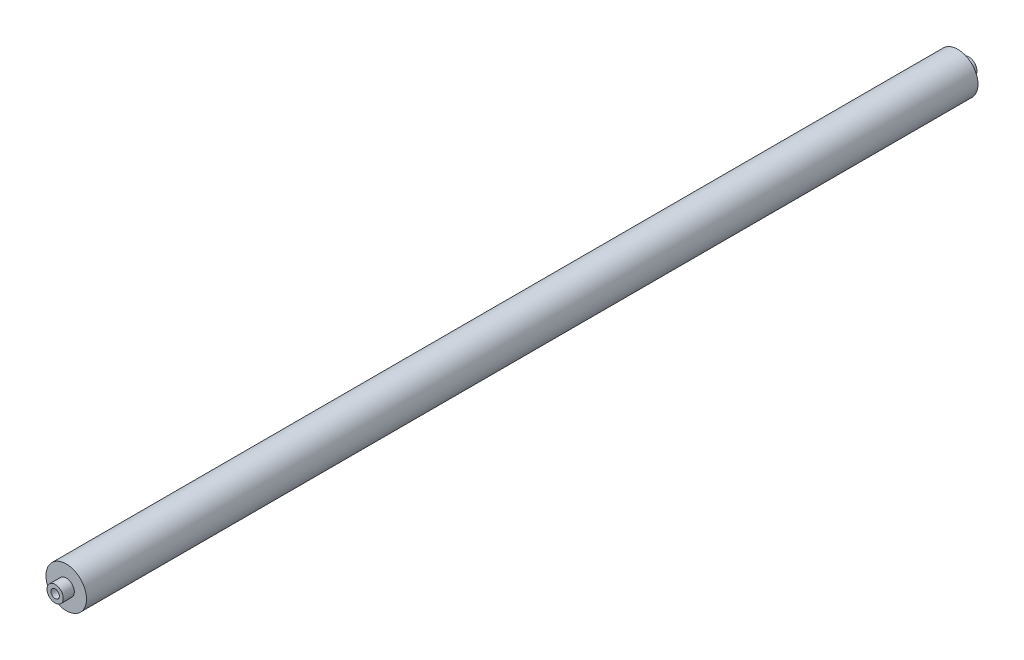
ISO-10303-21;
HEADER;
FILE_DESCRIPTION(('STEP AP214'),'2;1');
FILE_NAME('part.step','',(''),(''),'','','');
FILE_SCHEMA(('AUTOMOTIVE_DESIGN { 1 0 10303 214 1 1 1 1 }'));
ENDSEC;
DATA;
#1=APPLICATION_CONTEXT('core data for automotive mechanical design processes');
#2=APPLICATION_PROTOCOL_DEFINITION('international standard','automotive_design',2000,#1);
#3=PRODUCT_CONTEXT('',#1,'mechanical');
#4=PRODUCT('Part','Part','',(#3));
#5=PRODUCT_RELATED_PRODUCT_CATEGORY('part','',(#4));
#6=PRODUCT_DEFINITION_FORMATION('','',#4);
#7=PRODUCT_DEFINITION_CONTEXT('part definition',#1,'design');
#8=PRODUCT_DEFINITION('design','',#6,#7);
#9=PRODUCT_DEFINITION_SHAPE('','',#8);
#10=(LENGTH_UNIT() NAMED_UNIT(*) SI_UNIT(.MILLI.,.METRE.));
#11=(NAMED_UNIT(*) PLANE_ANGLE_UNIT() SI_UNIT($,.RADIAN.));
#12=(NAMED_UNIT(*) SI_UNIT($,.STERADIAN.) SOLID_ANGLE_UNIT());
#13=UNCERTAINTY_MEASURE_WITH_UNIT(LENGTH_MEASURE(1.E-05),#10,'distance_accuracy_value','');
#14=(GEOMETRIC_REPRESENTATION_CONTEXT(3) GLOBAL_UNCERTAINTY_ASSIGNED_CONTEXT((#13)) GLOBAL_UNIT_ASSIGNED_CONTEXT((#10,
#11,#12)) REPRESENTATION_CONTEXT('',''));
#15=CARTESIAN_POINT('',(0.,0.,0.));
#16=DIRECTION('',(0.,0.,1.));
#17=DIRECTION('',(1.,0.,0.));
#18=AXIS2_PLACEMENT_3D('',#15,#16,#17);
#19=CARTESIAN_POINT('',(0.,0.,698.5));
#20=DIRECTION('',(0.,0.,-1.));
#21=DIRECTION('',(-1.,0.,0.));
#22=AXIS2_PLACEMENT_3D('',#19,#20,#21);
#23=CYLINDRICAL_SURFACE('',#22,15.875);
#24=CARTESIAN_POINT('',(0.,0.,698.5));
#25=DIRECTION('',(0.,0.,1.));
#26=DIRECTION('',(1.,0.,0.));
#27=AXIS2_PLACEMENT_3D('',#24,#25,#26);
#28=CIRCLE('',#27,15.875);
#29=CARTESIAN_POINT('',(15.875,0.,698.5));
#30=VERTEX_POINT('',#29);
#31=EDGE_CURVE('E90',#30,#30,#28,.T.);
#32=ORIENTED_EDGE('',*,*,#31,.F.);
#33=EDGE_LOOP('',(#32));
#34=FACE_BOUND('',#33,.T.);
#35=CARTESIAN_POINT('',(0.,0.,0.));
#36=DIRECTION('',(0.,0.,1.));
#37=DIRECTION('',(1.,0.,0.));
#38=AXIS2_PLACEMENT_3D('',#35,#36,#37);
#39=CIRCLE('',#38,15.875);
#40=CARTESIAN_POINT('',(15.875,0.,0.));
#41=VERTEX_POINT('',#40);
#42=EDGE_CURVE('E94',#41,#41,#39,.T.);
#43=ORIENTED_EDGE('',*,*,#42,.T.);
#44=EDGE_LOOP('',(#43));
#45=FACE_BOUND('',#44,.T.);
#46=ADVANCED_FACE('F43',(#34,#45),#23,.T.);
#47=CARTESIAN_POINT('',(0.,0.,698.5));
#48=DIRECTION('',(0.,0.,1.));
#49=DIRECTION('',(1.,0.,0.));
#50=AXIS2_PLACEMENT_3D('',#47,#48,#49);
#51=PLANE('',#50);
#52=CARTESIAN_POINT('',(0.,0.,698.5));
#53=DIRECTION('',(0.,0.,1.));
#54=DIRECTION('',(1.,0.,0.));
#55=AXIS2_PLACEMENT_3D('',#52,#53,#54);
#56=CIRCLE('',#55,6.35);
#57=CARTESIAN_POINT('',(6.35,0.,698.5));
#58=VERTEX_POINT('',#57);
#59=EDGE_CURVE('E52',#58,#58,#56,.T.);
#60=ORIENTED_EDGE('',*,*,#59,.F.);
#61=EDGE_LOOP('',(#60));
#62=FACE_BOUND('',#61,.T.);
#63=ORIENTED_EDGE('',*,*,#31,.T.);
#64=EDGE_LOOP('',(#63));
#65=FACE_BOUND('',#64,.T.);
#66=ADVANCED_FACE('F121',(#62,#65),#51,.T.);
#67=CARTESIAN_POINT('',(0.,0.,0.));
#68=DIRECTION('',(0.,0.,1.));
#69=DIRECTION('',(1.,0.,0.));
#70=AXIS2_PLACEMENT_3D('',#67,#68,#69);
#71=PLANE('',#70);
#72=CARTESIAN_POINT('',(0.,0.,0.));
#73=DIRECTION('',(0.,0.,-1.));
#74=DIRECTION('',(-1.,0.,0.));
#75=AXIS2_PLACEMENT_3D('',#72,#73,#74);
#76=CIRCLE('',#75,6.35);
#77=CARTESIAN_POINT('',(-6.35,0.,0.));
#78=VERTEX_POINT('',#77);
#79=EDGE_CURVE('E11',#78,#78,#76,.T.);
#80=ORIENTED_EDGE('',*,*,#79,.F.);
#81=EDGE_LOOP('',(#80));
#82=FACE_BOUND('',#81,.T.);
#83=ORIENTED_EDGE('',*,*,#42,.F.);
#84=EDGE_LOOP('',(#83));
#85=FACE_BOUND('',#84,.T.);
#86=ADVANCED_FACE('F126',(#82,#85),#71,.F.);
#87=CARTESIAN_POINT('',(0.,0.,711.2));
#88=DIRECTION('',(0.,0.,-1.));
#89=DIRECTION('',(-1.,0.,0.));
#90=AXIS2_PLACEMENT_3D('',#87,#88,#89);
#91=CYLINDRICAL_SURFACE('',#90,6.35);
#92=CARTESIAN_POINT('',(0.,0.,707.2));
#93=DIRECTION('',(0.,0.,-1.));
#94=DIRECTION('',(-1.,0.,0.));
#95=AXIS2_PLACEMENT_3D('',#92,#93,#94);
#96=CIRCLE('',#95,6.35);
#97=CARTESIAN_POINT('',(-6.35,0.,707.2));
#98=VERTEX_POINT('',#97);
#99=EDGE_CURVE('E85',#98,#98,#96,.T.);
#100=ORIENTED_EDGE('',*,*,#99,.T.);
#101=EDGE_LOOP('',(#100));
#102=FACE_BOUND('',#101,.T.);
#103=ORIENTED_EDGE('',*,*,#59,.T.);
#104=EDGE_LOOP('',(#103));
#105=FACE_BOUND('',#104,.T.);
#106=ADVANCED_FACE('F101',(#102,#105),#91,.T.);
#107=CARTESIAN_POINT('',(0.,0.,-12.7));
#108=DIRECTION('',(0.,0.,1.));
#109=DIRECTION('',(1.,0.,0.));
#110=AXIS2_PLACEMENT_3D('',#107,#108,#109);
#111=CYLINDRICAL_SURFACE('',#110,6.35);
#112=CARTESIAN_POINT('',(0.,0.,-8.7));
#113=DIRECTION('',(0.,0.,1.));
#114=DIRECTION('',(1.,0.,0.));
#115=AXIS2_PLACEMENT_3D('',#112,#113,#114);
#116=CIRCLE('',#115,6.35);
#117=CARTESIAN_POINT('',(6.35,0.,-8.7));
#118=VERTEX_POINT('',#117);
#119=EDGE_CURVE('E46',#118,#118,#116,.T.);
#120=ORIENTED_EDGE('',*,*,#119,.T.);
#121=EDGE_LOOP('',(#120));
#122=FACE_BOUND('',#121,.T.);
#123=ORIENTED_EDGE('',*,*,#79,.T.);
#124=EDGE_LOOP('',(#123));
#125=FACE_BOUND('',#124,.T.);
#126=ADVANCED_FACE('F107',(#122,#125),#111,.T.);
#127=CARTESIAN_POINT('',(3.29999999999996,0.,707.2));
#128=DIRECTION('',(0.,0.,-1.));
#129=DIRECTION('',(-1.,0.,0.));
#130=AXIS2_PLACEMENT_3D('',#127,#128,#129);
#131=PLANE('',#130);
#132=CARTESIAN_POINT('',(0.,0.,707.2));
#133=DIRECTION('',(0.,0.,1.));
#134=DIRECTION('',(1.,0.,0.));
#135=AXIS2_PLACEMENT_3D('',#132,#133,#134);
#136=CIRCLE('',#135,3.29999999999996);
#137=CARTESIAN_POINT('',(3.29999999999996,0.,707.2));
#138=VERTEX_POINT('',#137);
#139=EDGE_CURVE('E75',#138,#138,#136,.T.);
#140=ORIENTED_EDGE('',*,*,#139,.F.);
#141=EDGE_LOOP('',(#140));
#142=FACE_BOUND('',#141,.T.);
#143=ORIENTED_EDGE('',*,*,#99,.F.);
#144=EDGE_LOOP('',(#143));
#145=FACE_BOUND('',#144,.T.);
#146=ADVANCED_FACE('F104',(#142,#145),#131,.F.);
#147=CARTESIAN_POINT('',(0.,0.,406.4));
#148=DIRECTION('',(0.,0.,1.));
#149=DIRECTION('',(1.,0.,0.));
#150=AXIS2_PLACEMENT_3D('',#147,#148,#149);
#151=CONICAL_SURFACE('',#150,3.29999999999993,1.02974425867663);
#152=CARTESIAN_POINT('',(0.,0.,404.417159957209));
#153=VERTEX_POINT('',#152);
#154=VERTEX_LOOP('',#153);
#155=FACE_BOUND('',#154,.T.);
#156=CARTESIAN_POINT('',(0.,0.,406.4));
#157=DIRECTION('',(0.,0.,1.));
#158=DIRECTION('',(1.,0.,0.));
#159=AXIS2_PLACEMENT_3D('',#156,#157,#158);
#160=CIRCLE('',#159,3.29999999999993);
#161=CARTESIAN_POINT('',(3.29999999999993,0.,406.4));
#162=VERTEX_POINT('',#161);
#163=EDGE_CURVE('E82',#162,#162,#160,.T.);
#164=ORIENTED_EDGE('',*,*,#163,.T.);
#165=EDGE_LOOP('',(#164));
#166=FACE_BOUND('',#165,.T.);
#167=ADVANCED_FACE('F106',(#155,#166),#151,.F.);
#168=CARTESIAN_POINT('',(0.,0.,711.2));
#169=DIRECTION('',(0.,0.,1.));
#170=DIRECTION('',(1.,0.,0.));
#171=AXIS2_PLACEMENT_3D('',#168,#169,#170);
#172=CYLINDRICAL_SURFACE('',#171,3.29999999999994);
#173=ORIENTED_EDGE('',*,*,#163,.F.);
#174=EDGE_LOOP('',(#173));
#175=FACE_BOUND('',#174,.T.);
#176=ORIENTED_EDGE('',*,*,#139,.T.);
#177=EDGE_LOOP('',(#176));
#178=FACE_BOUND('',#177,.T.);
#179=ADVANCED_FACE('F114',(#175,#178),#172,.F.);
#180=CARTESIAN_POINT('',(3.29999999999996,0.,-8.7));
#181=DIRECTION('',(0.,0.,1.));
#182=DIRECTION('',(1.,0.,0.));
#183=AXIS2_PLACEMENT_3D('',#180,#181,#182);
#184=PLANE('',#183);
#185=CARTESIAN_POINT('',(0.,0.,-8.7));
#186=DIRECTION('',(0.,0.,-1.));
#187=DIRECTION('',(-1.,0.,0.));
#188=AXIS2_PLACEMENT_3D('',#185,#186,#187);
#189=CIRCLE('',#188,3.29999999999996);
#190=CARTESIAN_POINT('',(-3.29999999999996,0.,-8.7));
#191=VERTEX_POINT('',#190);
#192=EDGE_CURVE('E70',#191,#191,#189,.T.);
#193=ORIENTED_EDGE('',*,*,#192,.F.);
#194=EDGE_LOOP('',(#193));
#195=FACE_BOUND('',#194,.T.);
#196=ORIENTED_EDGE('',*,*,#119,.F.);
#197=EDGE_LOOP('',(#196));
#198=FACE_BOUND('',#197,.T.);
#199=ADVANCED_FACE('F63',(#195,#198),#184,.F.);
#200=CARTESIAN_POINT('',(0.,0.,292.1));
#201=DIRECTION('',(0.,0.,-1.));
#202=DIRECTION('',(-1.,0.,0.));
#203=AXIS2_PLACEMENT_3D('',#200,#201,#202);
#204=CONICAL_SURFACE('',#203,3.29999999999992,1.02974425867664);
#205=CARTESIAN_POINT('',(0.,0.,294.082840042791));
#206=VERTEX_POINT('',#205);
#207=VERTEX_LOOP('',#206);
#208=FACE_BOUND('',#207,.T.);
#209=CARTESIAN_POINT('',(0.,0.,292.1));
#210=DIRECTION('',(0.,0.,-1.));
#211=DIRECTION('',(-1.,0.,0.));
#212=AXIS2_PLACEMENT_3D('',#209,#210,#211);
#213=CIRCLE('',#212,3.29999999999992);
#214=CARTESIAN_POINT('',(-3.29999999999992,0.,292.1));
#215=VERTEX_POINT('',#214);
#216=EDGE_CURVE('E67',#215,#215,#213,.T.);
#217=ORIENTED_EDGE('',*,*,#216,.T.);
#218=EDGE_LOOP('',(#217));
#219=FACE_BOUND('',#218,.T.);
#220=ADVANCED_FACE('F59',(#208,#219),#204,.F.);
#221=CARTESIAN_POINT('',(0.,0.,-12.7));
#222=DIRECTION('',(0.,0.,-1.));
#223=DIRECTION('',(-1.,0.,0.));
#224=AXIS2_PLACEMENT_3D('',#221,#222,#223);
#225=CYLINDRICAL_SURFACE('',#224,3.29999999999994);
#226=ORIENTED_EDGE('',*,*,#216,.F.);
#227=EDGE_LOOP('',(#226));
#228=FACE_BOUND('',#227,.T.);
#229=ORIENTED_EDGE('',*,*,#192,.T.);
#230=EDGE_LOOP('',(#229));
#231=FACE_BOUND('',#230,.T.);
#232=ADVANCED_FACE('F62',(#228,#231),#225,.F.);
#233=CLOSED_SHELL('',(#46,#66,#86,#106,#126,#146,#167,#179,#199,#220,#232));
#234=MANIFOLD_SOLID_BREP('B2',#233);
#235=ADVANCED_BREP_SHAPE_REPRESENTATION('',(#18,#234),#14);
#236=SHAPE_DEFINITION_REPRESENTATION(#9,#235);
ENDSEC;
END-ISO-10303-21;
